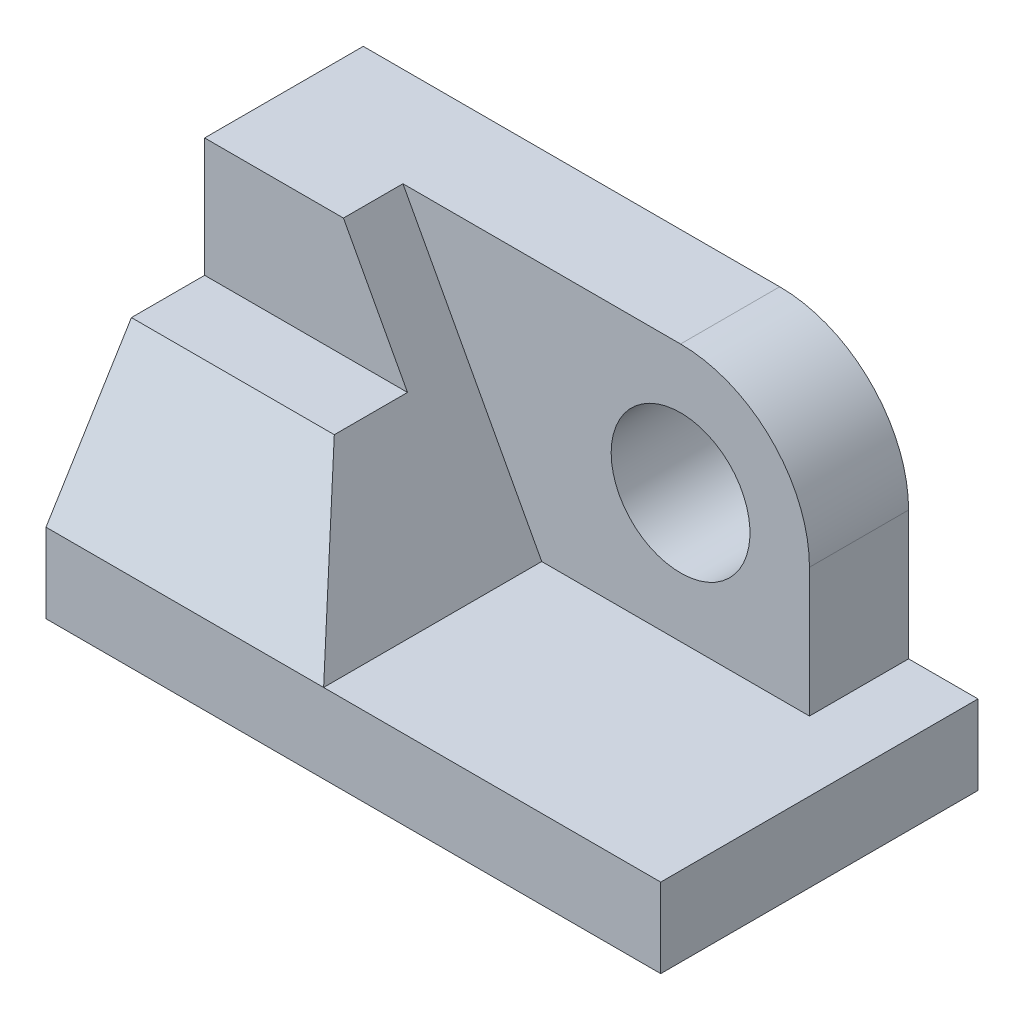
ISO-10303-21;
HEADER;
FILE_DESCRIPTION(('STEP AP214'),'2;1');
FILE_NAME('part.step','',(''),(''),'','','');
FILE_SCHEMA(('AUTOMOTIVE_DESIGN { 1 0 10303 214 1 1 1 1 }'));
ENDSEC;
DATA;
#1=APPLICATION_CONTEXT('core data for automotive mechanical design processes');
#2=APPLICATION_PROTOCOL_DEFINITION('international standard','automotive_design',2000,#1);
#3=PRODUCT_CONTEXT('',#1,'mechanical');
#4=PRODUCT('Part','Part','',(#3));
#5=PRODUCT_RELATED_PRODUCT_CATEGORY('part','',(#4));
#6=PRODUCT_DEFINITION_FORMATION('','',#4);
#7=PRODUCT_DEFINITION_CONTEXT('part definition',#1,'design');
#8=PRODUCT_DEFINITION('design','',#6,#7);
#9=PRODUCT_DEFINITION_SHAPE('','',#8);
#10=(LENGTH_UNIT() NAMED_UNIT(*) SI_UNIT(.MILLI.,.METRE.));
#11=(NAMED_UNIT(*) PLANE_ANGLE_UNIT() SI_UNIT($,.RADIAN.));
#12=(NAMED_UNIT(*) SI_UNIT($,.STERADIAN.) SOLID_ANGLE_UNIT());
#13=UNCERTAINTY_MEASURE_WITH_UNIT(LENGTH_MEASURE(1.E-05),#10,'distance_accuracy_value','');
#14=(GEOMETRIC_REPRESENTATION_CONTEXT(3) GLOBAL_UNCERTAINTY_ASSIGNED_CONTEXT((#13)) GLOBAL_UNIT_ASSIGNED_CONTEXT((#10,
#11,#12)) REPRESENTATION_CONTEXT('',''));
#15=CARTESIAN_POINT('',(0.,0.,0.));
#16=DIRECTION('',(0.,0.,1.));
#17=DIRECTION('',(1.,0.,0.));
#18=AXIS2_PLACEMENT_3D('',#15,#16,#17);
#19=CARTESIAN_POINT('',(-31.,8.,-16.));
#20=DIRECTION('',(1.,0.,0.));
#21=DIRECTION('',(0.,0.,-1.));
#22=AXIS2_PLACEMENT_3D('',#19,#20,#21);
#23=PLANE('',#22);
#24=DIRECTION('',(0.,-1.,0.));
#25=VECTOR('',#24,1.);
#26=CARTESIAN_POINT('',(-31.,34.0001,0.));
#27=LINE('',#26,#25);
#28=CARTESIAN_POINT('',(-31.,34.,0.));
#29=VERTEX_POINT('',#28);
#30=CARTESIAN_POINT('',(-31.,22.,0.));
#31=VERTEX_POINT('',#30);
#32=EDGE_CURVE('E275',#29,#31,#27,.T.);
#33=ORIENTED_EDGE('',*,*,#32,.F.);
#34=DIRECTION('',(0.,0.,1.));
#35=VECTOR('',#34,1.);
#36=CARTESIAN_POINT('',(-31.,34.,-6.));
#37=LINE('',#36,#35);
#38=CARTESIAN_POINT('',(-31.,34.,-6.));
#39=VERTEX_POINT('',#38);
#40=EDGE_CURVE('E148',#39,#29,#37,.T.);
#41=ORIENTED_EDGE('',*,*,#40,.F.);
#42=DIRECTION('',(0.,0.,-1.));
#43=VECTOR('',#42,1.);
#44=CARTESIAN_POINT('',(-31.,34.,-6.));
#45=LINE('',#44,#43);
#46=CARTESIAN_POINT('',(-31.,34.,-16.));
#47=VERTEX_POINT('',#46);
#48=EDGE_CURVE('E240',#39,#47,#45,.T.);
#49=ORIENTED_EDGE('',*,*,#48,.T.);
#50=DIRECTION('',(0.,-1.,0.));
#51=VECTOR('',#50,1.);
#52=CARTESIAN_POINT('',(-31.,8.,-16.));
#53=LINE('',#52,#51);
#54=CARTESIAN_POINT('',(-31.,0.,-16.));
#55=VERTEX_POINT('',#54);
#56=EDGE_CURVE('E259',#47,#55,#53,.T.);
#57=ORIENTED_EDGE('',*,*,#56,.T.);
#58=DIRECTION('',(0.,0.,1.));
#59=VECTOR('',#58,1.);
#60=CARTESIAN_POINT('',(-31.,0.,-16.));
#61=LINE('',#60,#59);
#62=CARTESIAN_POINT('',(-31.,0.,16.));
#63=VERTEX_POINT('',#62);
#64=EDGE_CURVE('E255',#55,#63,#61,.T.);
#65=ORIENTED_EDGE('',*,*,#64,.T.);
#66=DIRECTION('',(0.,-1.,0.));
#67=VECTOR('',#66,1.);
#68=CARTESIAN_POINT('',(-31.,8.,16.));
#69=LINE('',#68,#67);
#70=CARTESIAN_POINT('',(-31.,8.,16.));
#71=VERTEX_POINT('',#70);
#72=EDGE_CURVE('E86',#71,#63,#69,.T.);
#73=ORIENTED_EDGE('',*,*,#72,.F.);
#74=DIRECTION('',(0.,0.851658316704544,-0.524097425664335));
#75=VECTOR('',#74,1.);
#76=CARTESIAN_POINT('',(-31.,8.,16.));
#77=LINE('',#76,#75);
#78=CARTESIAN_POINT('',(-31.,22.,7.38461538461539));
#79=VERTEX_POINT('',#78);
#80=EDGE_CURVE('E192',#71,#79,#77,.T.);
#81=ORIENTED_EDGE('',*,*,#80,.T.);
#82=DIRECTION('',(0.,0.,1.));
#83=VECTOR('',#82,1.);
#84=CARTESIAN_POINT('',(-31.,22.,8.44434802949098));
#85=LINE('',#84,#83);
#86=EDGE_CURVE('E328',#31,#79,#85,.T.);
#87=ORIENTED_EDGE('',*,*,#86,.F.);
#88=EDGE_LOOP('',(#33,#41,#49,#57,#65,#73,#81,#87));
#89=FACE_BOUND('',#88,.T.);
#90=ADVANCED_FACE('F45',(#89),#23,.F.);
#91=CARTESIAN_POINT('',(0.,9.33905579399142,15.175965665236));
#92=DIRECTION('',(0.,-0.524097425664335,-0.851658316704544));
#93=DIRECTION('',(0.,0.851658316704544,-0.524097425664335));
#94=AXIS2_PLACEMENT_3D('',#91,#92,#93);
#95=PLANE('',#94);
#96=DIRECTION('',(1.,0.,0.));
#97=VECTOR('',#96,1.);
#98=CARTESIAN_POINT('',(0.,22.,7.38461538461538));
#99=LINE('',#98,#97);
#100=CARTESIAN_POINT('',(-10.5384615384615,22.,7.38461538461539));
#101=VERTEX_POINT('',#100);
#102=EDGE_CURVE('E63',#79,#101,#99,.T.);
#103=ORIENTED_EDGE('',*,*,#102,.F.);
#104=ORIENTED_EDGE('',*,*,#80,.F.);
#105=DIRECTION('',(1.,0.,0.));
#106=VECTOR('',#105,1.);
#107=CARTESIAN_POINT('',(0.,8.,16.));
#108=LINE('',#107,#106);
#109=CARTESIAN_POINT('',(-3.00000000000002,8.,16.));
#110=VERTEX_POINT('',#109);
#111=EDGE_CURVE('E179',#71,#110,#108,.T.);
#112=ORIENTED_EDGE('',*,*,#111,.T.);
#113=DIRECTION('',(-0.416843933922789,0.774138734428038,-0.476393067340331));
#114=VECTOR('',#113,1.);
#115=CARTESIAN_POINT('',(-3.00000000000001,8.,16.));
#116=LINE('',#115,#114);
#117=EDGE_CURVE('E141',#110,#101,#116,.T.);
#118=ORIENTED_EDGE('',*,*,#117,.T.);
#119=EDGE_LOOP('',(#103,#104,#112,#118));
#120=FACE_BOUND('',#119,.T.);
#121=ADVANCED_FACE('F311',(#120),#95,.F.);
#122=CARTESIAN_POINT('',(1.0137614678899,0.545871559633022,0.));
#123=DIRECTION('',(-0.880471099922175,-0.474099823035017,0.));
#124=DIRECTION('',(0.474099823035017,-0.880471099922175,0.));
#125=AXIS2_PLACEMENT_3D('',#122,#123,#124);
#126=PLANE('',#125);
#127=DIRECTION('',(-0.474099823035017,0.880471099922175,0.));
#128=VECTOR('',#127,1.);
#129=CARTESIAN_POINT('',(1.0137614678899,0.545871559633022,0.));
#130=LINE('',#129,#128);
#131=CARTESIAN_POINT('',(-10.5384615384615,22.,0.));
#132=VERTEX_POINT('',#131);
#133=CARTESIAN_POINT('',(-17.,34.,0.));
#134=VERTEX_POINT('',#133);
#135=EDGE_CURVE('E12',#132,#134,#130,.T.);
#136=ORIENTED_EDGE('',*,*,#135,.F.);
#137=DIRECTION('',(0.,0.,-1.));
#138=VECTOR('',#137,1.);
#139=CARTESIAN_POINT('',(-10.5384615384615,22.,0.));
#140=LINE('',#139,#138);
#141=EDGE_CURVE('E55',#101,#132,#140,.T.);
#142=ORIENTED_EDGE('',*,*,#141,.F.);
#143=ORIENTED_EDGE('',*,*,#117,.F.);
#144=DIRECTION('',(0.,0.,-1.));
#145=VECTOR('',#144,1.);
#146=CARTESIAN_POINT('',(-3.00000000000001,8.,16.));
#147=LINE('',#146,#145);
#148=CARTESIAN_POINT('',(-3.00000000000001,8.,-6.));
#149=VERTEX_POINT('',#148);
#150=EDGE_CURVE('E72',#110,#149,#147,.T.);
#151=ORIENTED_EDGE('',*,*,#150,.T.);
#152=DIRECTION('',(-0.474099823035017,0.880471099922175,0.));
#153=VECTOR('',#152,1.);
#154=CARTESIAN_POINT('',(-3.00000000000001,8.,-6.));
#155=LINE('',#154,#153);
#156=CARTESIAN_POINT('',(-17.,34.,-6.));
#157=VERTEX_POINT('',#156);
#158=EDGE_CURVE('E122',#149,#157,#155,.T.);
#159=ORIENTED_EDGE('',*,*,#158,.T.);
#160=DIRECTION('',(0.,0.,-1.));
#161=VECTOR('',#160,1.);
#162=CARTESIAN_POINT('',(-17.,34.,0.));
#163=LINE('',#162,#161);
#164=EDGE_CURVE('E49',#134,#157,#163,.T.);
#165=ORIENTED_EDGE('',*,*,#164,.F.);
#166=EDGE_LOOP('',(#136,#142,#143,#151,#159,#165));
#167=FACE_BOUND('',#166,.T.);
#168=ADVANCED_FACE('F135',(#167),#126,.F.);
#169=CARTESIAN_POINT('',(0.,8.,0.));
#170=DIRECTION('',(0.,1.,0.));
#171=DIRECTION('',(0.,0.,1.));
#172=AXIS2_PLACEMENT_3D('',#169,#170,#171);
#173=PLANE('',#172);
#174=DIRECTION('',(1.,0.,0.));
#175=VECTOR('',#174,1.);
#176=CARTESIAN_POINT('',(0.,8.,-6.));
#177=LINE('',#176,#175);
#178=CARTESIAN_POINT('',(24.,8.,-6.));
#179=VERTEX_POINT('',#178);
#180=EDGE_CURVE('E219',#149,#179,#177,.T.);
#181=ORIENTED_EDGE('',*,*,#180,.F.);
#182=ORIENTED_EDGE('',*,*,#150,.F.);
#183=DIRECTION('',(1.,0.,0.));
#184=VECTOR('',#183,1.);
#185=CARTESIAN_POINT('',(-31.,8.,16.));
#186=LINE('',#185,#184);
#187=CARTESIAN_POINT('',(31.,8.,16.));
#188=VERTEX_POINT('',#187);
#189=EDGE_CURVE('E188',#110,#188,#186,.T.);
#190=ORIENTED_EDGE('',*,*,#189,.T.);
#191=DIRECTION('',(0.,0.,-1.));
#192=VECTOR('',#191,1.);
#193=CARTESIAN_POINT('',(31.,8.,-16.));
#194=LINE('',#193,#192);
#195=CARTESIAN_POINT('',(31.,8.,-16.));
#196=VERTEX_POINT('',#195);
#197=EDGE_CURVE('E245',#188,#196,#194,.T.);
#198=ORIENTED_EDGE('',*,*,#197,.T.);
#199=DIRECTION('',(-1.,0.,0.));
#200=VECTOR('',#199,1.);
#201=CARTESIAN_POINT('',(-31.,8.,-16.));
#202=LINE('',#201,#200);
#203=CARTESIAN_POINT('',(24.,8.,-16.));
#204=VERTEX_POINT('',#203);
#205=EDGE_CURVE('E97',#196,#204,#202,.T.);
#206=ORIENTED_EDGE('',*,*,#205,.T.);
#207=DIRECTION('',(0.,0.,-1.));
#208=VECTOR('',#207,1.);
#209=CARTESIAN_POINT('',(24.,8.,-6.));
#210=LINE('',#209,#208);
#211=EDGE_CURVE('E237',#179,#204,#210,.T.);
#212=ORIENTED_EDGE('',*,*,#211,.F.);
#213=EDGE_LOOP('',(#181,#182,#190,#198,#206,#212));
#214=FACE_BOUND('',#213,.T.);
#215=ADVANCED_FACE('F306',(#214),#173,.T.);
#216=CARTESIAN_POINT('',(0.,0.,-6.));
#217=DIRECTION('',(0.,0.,-1.));
#218=DIRECTION('',(-1.,0.,0.));
#219=AXIS2_PLACEMENT_3D('',#216,#217,#218);
#220=PLANE('',#219);
#221=CARTESIAN_POINT('',(11.,21.,-6.));
#222=DIRECTION('',(0.,0.,-1.));
#223=DIRECTION('',(-1.,0.,0.));
#224=AXIS2_PLACEMENT_3D('',#221,#222,#223);
#225=CIRCLE('',#224,7.);
#226=CARTESIAN_POINT('',(4.,21.,-6.));
#227=VERTEX_POINT('',#226);
#228=EDGE_CURVE('E130',#227,#227,#225,.T.);
#229=ORIENTED_EDGE('',*,*,#228,.T.);
#230=EDGE_LOOP('',(#229));
#231=FACE_BOUND('',#230,.T.);
#232=ORIENTED_EDGE('',*,*,#158,.F.);
#233=ORIENTED_EDGE('',*,*,#180,.T.);
#234=DIRECTION('',(0.,1.,0.));
#235=VECTOR('',#234,1.);
#236=CARTESIAN_POINT('',(24.,0.,-6.));
#237=LINE('',#236,#235);
#238=CARTESIAN_POINT('',(24.,21.,-6.));
#239=VERTEX_POINT('',#238);
#240=EDGE_CURVE('E223',#179,#239,#237,.T.);
#241=ORIENTED_EDGE('',*,*,#240,.T.);
#242=CARTESIAN_POINT('',(11.,21.,-6.));
#243=DIRECTION('',(0.,0.,-1.));
#244=DIRECTION('',(-1.,0.,0.));
#245=AXIS2_PLACEMENT_3D('',#242,#243,#244);
#246=CIRCLE('',#245,13.);
#247=CARTESIAN_POINT('',(11.,34.,-6.));
#248=VERTEX_POINT('',#247);
#249=EDGE_CURVE('E126',#248,#239,#246,.T.);
#250=ORIENTED_EDGE('',*,*,#249,.F.);
#251=DIRECTION('',(-1.,0.,0.));
#252=VECTOR('',#251,1.);
#253=CARTESIAN_POINT('',(0.,34.,-6.));
#254=LINE('',#253,#252);
#255=EDGE_CURVE('E118',#248,#157,#254,.T.);
#256=ORIENTED_EDGE('',*,*,#255,.T.);
#257=EDGE_LOOP('',(#232,#233,#241,#250,#256));
#258=FACE_BOUND('',#257,.T.);
#259=ADVANCED_FACE('F120',(#231,#258),#220,.F.);
#260=CARTESIAN_POINT('',(31.,8.,-16.));
#261=DIRECTION('',(-1.,0.,0.));
#262=DIRECTION('',(0.,0.,1.));
#263=AXIS2_PLACEMENT_3D('',#260,#261,#262);
#264=PLANE('',#263);
#265=DIRECTION('',(0.,0.,-1.));
#266=VECTOR('',#265,1.);
#267=CARTESIAN_POINT('',(31.,0.,-16.));
#268=LINE('',#267,#266);
#269=CARTESIAN_POINT('',(31.,0.,16.));
#270=VERTEX_POINT('',#269);
#271=CARTESIAN_POINT('',(31.,0.,-16.));
#272=VERTEX_POINT('',#271);
#273=EDGE_CURVE('E250',#270,#272,#268,.T.);
#274=ORIENTED_EDGE('',*,*,#273,.T.);
#275=DIRECTION('',(0.,-1.,0.));
#276=VECTOR('',#275,1.);
#277=CARTESIAN_POINT('',(31.,8.,-16.));
#278=LINE('',#277,#276);
#279=EDGE_CURVE('E195',#196,#272,#278,.T.);
#280=ORIENTED_EDGE('',*,*,#279,.F.);
#281=ORIENTED_EDGE('',*,*,#197,.F.);
#282=DIRECTION('',(0.,-1.,0.));
#283=VECTOR('',#282,1.);
#284=CARTESIAN_POINT('',(31.,8.,16.));
#285=LINE('',#284,#283);
#286=EDGE_CURVE('E187',#188,#270,#285,.T.);
#287=ORIENTED_EDGE('',*,*,#286,.T.);
#288=EDGE_LOOP('',(#274,#280,#281,#287));
#289=FACE_BOUND('',#288,.T.);
#290=ADVANCED_FACE('F47',(#289),#264,.F.);
#291=CARTESIAN_POINT('',(-31.,8.,-16.));
#292=DIRECTION('',(0.,0.,1.));
#293=DIRECTION('',(1.,0.,0.));
#294=AXIS2_PLACEMENT_3D('',#291,#292,#293);
#295=PLANE('',#294);
#296=DIRECTION('',(-1.,0.,0.));
#297=VECTOR('',#296,1.);
#298=CARTESIAN_POINT('',(-31.,0.,-16.));
#299=LINE('',#298,#297);
#300=EDGE_CURVE('E253',#272,#55,#299,.T.);
#301=ORIENTED_EDGE('',*,*,#300,.T.);
#302=ORIENTED_EDGE('',*,*,#56,.F.);
#303=DIRECTION('',(-1.,0.,0.));
#304=VECTOR('',#303,1.);
#305=CARTESIAN_POINT('',(0.,34.,-16.));
#306=LINE('',#305,#304);
#307=CARTESIAN_POINT('',(11.,34.,-16.));
#308=VERTEX_POINT('',#307);
#309=EDGE_CURVE('E230',#308,#47,#306,.T.);
#310=ORIENTED_EDGE('',*,*,#309,.F.);
#311=CARTESIAN_POINT('',(11.,21.,-16.));
#312=DIRECTION('',(0.,0.,-1.));
#313=DIRECTION('',(-1.,0.,0.));
#314=AXIS2_PLACEMENT_3D('',#311,#312,#313);
#315=CIRCLE('',#314,13.);
#316=CARTESIAN_POINT('',(24.,21.,-16.));
#317=VERTEX_POINT('',#316);
#318=EDGE_CURVE('E232',#308,#317,#315,.T.);
#319=ORIENTED_EDGE('',*,*,#318,.T.);
#320=DIRECTION('',(0.,1.,0.));
#321=VECTOR('',#320,1.);
#322=CARTESIAN_POINT('',(24.,0.,-16.));
#323=LINE('',#322,#321);
#324=EDGE_CURVE('E212',#204,#317,#323,.T.);
#325=ORIENTED_EDGE('',*,*,#324,.F.);
#326=ORIENTED_EDGE('',*,*,#205,.F.);
#327=ORIENTED_EDGE('',*,*,#279,.T.);
#328=EDGE_LOOP('',(#301,#302,#310,#319,#325,#326,#327));
#329=FACE_BOUND('',#328,.T.);
#330=CARTESIAN_POINT('',(11.,21.,-16.));
#331=DIRECTION('',(0.,0.,-1.));
#332=DIRECTION('',(-1.,0.,0.));
#333=AXIS2_PLACEMENT_3D('',#330,#331,#332);
#334=CIRCLE('',#333,7.);
#335=CARTESIAN_POINT('',(4.,21.,-16.));
#336=VERTEX_POINT('',#335);
#337=EDGE_CURVE('E202',#336,#336,#334,.T.);
#338=ORIENTED_EDGE('',*,*,#337,.F.);
#339=EDGE_LOOP('',(#338));
#340=FACE_BOUND('',#339,.T.);
#341=ADVANCED_FACE('F297',(#329,#340),#295,.F.);
#342=CARTESIAN_POINT('',(-31.,8.,16.));
#343=DIRECTION('',(0.,0.,-1.));
#344=DIRECTION('',(-1.,0.,0.));
#345=AXIS2_PLACEMENT_3D('',#342,#343,#344);
#346=PLANE('',#345);
#347=DIRECTION('',(1.,0.,0.));
#348=VECTOR('',#347,1.);
#349=CARTESIAN_POINT('',(-31.,0.,16.));
#350=LINE('',#349,#348);
#351=EDGE_CURVE('E247',#63,#270,#350,.T.);
#352=ORIENTED_EDGE('',*,*,#351,.T.);
#353=ORIENTED_EDGE('',*,*,#286,.F.);
#354=ORIENTED_EDGE('',*,*,#189,.F.);
#355=ORIENTED_EDGE('',*,*,#111,.F.);
#356=ORIENTED_EDGE('',*,*,#72,.T.);
#357=EDGE_LOOP('',(#352,#353,#354,#355,#356));
#358=FACE_BOUND('',#357,.T.);
#359=ADVANCED_FACE('F303',(#358),#346,.F.);
#360=CARTESIAN_POINT('',(0.,0.,0.));
#361=DIRECTION('',(0.,1.,0.));
#362=DIRECTION('',(0.,0.,1.));
#363=AXIS2_PLACEMENT_3D('',#360,#361,#362);
#364=PLANE('',#363);
#365=ORIENTED_EDGE('',*,*,#273,.F.);
#366=ORIENTED_EDGE('',*,*,#351,.F.);
#367=ORIENTED_EDGE('',*,*,#64,.F.);
#368=ORIENTED_EDGE('',*,*,#300,.F.);
#369=EDGE_LOOP('',(#365,#366,#367,#368));
#370=FACE_BOUND('',#369,.T.);
#371=ADVANCED_FACE('F170',(#370),#364,.F.);
#372=CARTESIAN_POINT('',(0.,34.,-6.));
#373=DIRECTION('',(0.,-1.,0.));
#374=DIRECTION('',(1.,0.,0.));
#375=AXIS2_PLACEMENT_3D('',#372,#373,#374);
#376=PLANE('',#375);
#377=ORIENTED_EDGE('',*,*,#309,.T.);
#378=ORIENTED_EDGE('',*,*,#48,.F.);
#379=ORIENTED_EDGE('',*,*,#40,.T.);
#380=DIRECTION('',(1.,0.,0.));
#381=VECTOR('',#380,1.);
#382=CARTESIAN_POINT('',(-31.,34.,0.));
#383=LINE('',#382,#381);
#384=EDGE_CURVE('E140',#29,#134,#383,.T.);
#385=ORIENTED_EDGE('',*,*,#384,.T.);
#386=ORIENTED_EDGE('',*,*,#164,.T.);
#387=ORIENTED_EDGE('',*,*,#255,.F.);
#388=DIRECTION('',(0.,0.,-1.));
#389=VECTOR('',#388,1.);
#390=CARTESIAN_POINT('',(11.,34.,-6.));
#391=LINE('',#390,#389);
#392=EDGE_CURVE('E222',#248,#308,#391,.T.);
#393=ORIENTED_EDGE('',*,*,#392,.T.);
#394=EDGE_LOOP('',(#377,#378,#379,#385,#386,#387,#393));
#395=FACE_BOUND('',#394,.T.);
#396=ADVANCED_FACE('F145',(#395),#376,.F.);
#397=CARTESIAN_POINT('',(24.,0.,-6.));
#398=DIRECTION('',(-1.,0.,0.));
#399=DIRECTION('',(0.,-1.,0.));
#400=AXIS2_PLACEMENT_3D('',#397,#398,#399);
#401=PLANE('',#400);
#402=ORIENTED_EDGE('',*,*,#324,.T.);
#403=DIRECTION('',(0.,0.,-1.));
#404=VECTOR('',#403,1.);
#405=CARTESIAN_POINT('',(24.,21.,-6.));
#406=LINE('',#405,#404);
#407=EDGE_CURVE('E241',#239,#317,#406,.T.);
#408=ORIENTED_EDGE('',*,*,#407,.F.);
#409=ORIENTED_EDGE('',*,*,#240,.F.);
#410=ORIENTED_EDGE('',*,*,#211,.T.);
#411=EDGE_LOOP('',(#402,#408,#409,#410));
#412=FACE_BOUND('',#411,.T.);
#413=ADVANCED_FACE('F169',(#412),#401,.F.);
#414=CARTESIAN_POINT('',(11.,21.,-6.));
#415=DIRECTION('',(0.,0.,-1.));
#416=DIRECTION('',(-1.,0.,0.));
#417=AXIS2_PLACEMENT_3D('',#414,#415,#416);
#418=CYLINDRICAL_SURFACE('',#417,7.);
#419=ORIENTED_EDGE('',*,*,#228,.F.);
#420=EDGE_LOOP('',(#419));
#421=FACE_BOUND('',#420,.T.);
#422=ORIENTED_EDGE('',*,*,#337,.T.);
#423=EDGE_LOOP('',(#422));
#424=FACE_BOUND('',#423,.T.);
#425=ADVANCED_FACE('F173',(#421,#424),#418,.F.);
#426=CARTESIAN_POINT('',(11.,21.,-6.));
#427=DIRECTION('',(0.,0.,-1.));
#428=DIRECTION('',(-1.,0.,0.));
#429=AXIS2_PLACEMENT_3D('',#426,#427,#428);
#430=CYLINDRICAL_SURFACE('',#429,13.);
#431=ORIENTED_EDGE('',*,*,#318,.F.);
#432=ORIENTED_EDGE('',*,*,#392,.F.);
#433=ORIENTED_EDGE('',*,*,#249,.T.);
#434=ORIENTED_EDGE('',*,*,#407,.T.);
#435=EDGE_LOOP('',(#431,#432,#433,#434));
#436=FACE_BOUND('',#435,.T.);
#437=ADVANCED_FACE('F171',(#436),#430,.T.);
#438=CARTESIAN_POINT('',(-9.61119547419541,34.0001,0.));
#439=DIRECTION('',(0.,0.,1.));
#440=DIRECTION('',(1.,0.,0.));
#441=AXIS2_PLACEMENT_3D('',#438,#439,#440);
#442=PLANE('',#441);
#443=ORIENTED_EDGE('',*,*,#384,.F.);
#444=ORIENTED_EDGE('',*,*,#32,.T.);
#445=DIRECTION('',(-1.,0.,0.));
#446=VECTOR('',#445,1.);
#447=CARTESIAN_POINT('',(-9.61119547419541,22.,0.));
#448=LINE('',#447,#446);
#449=EDGE_CURVE('E323',#132,#31,#448,.T.);
#450=ORIENTED_EDGE('',*,*,#449,.F.);
#451=ORIENTED_EDGE('',*,*,#135,.T.);
#452=EDGE_LOOP('',(#443,#444,#450,#451));
#453=FACE_BOUND('',#452,.T.);
#454=ADVANCED_FACE('F333',(#453),#442,.T.);
#455=CARTESIAN_POINT('',(0.,22.,0.));
#456=DIRECTION('',(0.,1.,0.));
#457=DIRECTION('',(0.,0.,1.));
#458=AXIS2_PLACEMENT_3D('',#455,#456,#457);
#459=PLANE('',#458);
#460=ORIENTED_EDGE('',*,*,#102,.T.);
#461=ORIENTED_EDGE('',*,*,#141,.T.);
#462=ORIENTED_EDGE('',*,*,#449,.T.);
#463=ORIENTED_EDGE('',*,*,#86,.T.);
#464=EDGE_LOOP('',(#460,#461,#462,#463));
#465=FACE_BOUND('',#464,.T.);
#466=ADVANCED_FACE('F329',(#465),#459,.T.);
#467=CLOSED_SHELL('',(#90,#121,#168,#215,#259,#290,#341,#359,#371,#396,#413,#425,#437,#454,#466));
#468=MANIFOLD_SOLID_BREP('B2',#467);
#469=ADVANCED_BREP_SHAPE_REPRESENTATION('',(#18,#468),#14);
#470=SHAPE_DEFINITION_REPRESENTATION(#9,#469);
ENDSEC;
END-ISO-10303-21;
